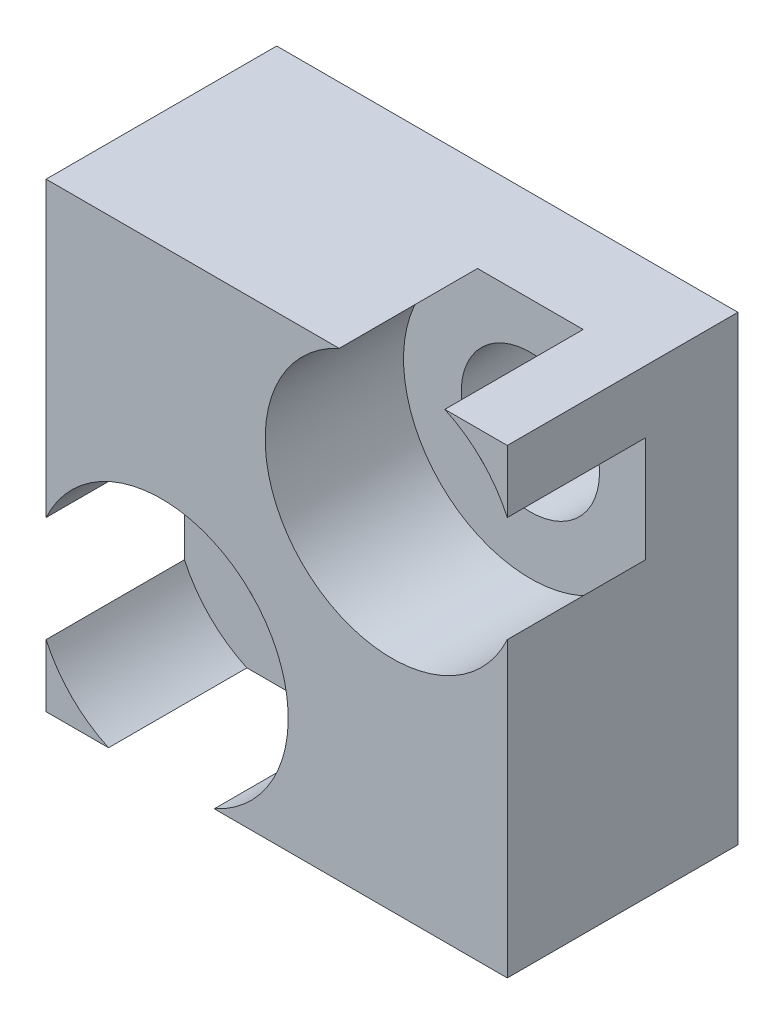
ISO-10303-21;
HEADER;
FILE_DESCRIPTION(('STEP AP214'),'2;1');
FILE_NAME('part.step','',(''),(''),'','','');
FILE_SCHEMA(('AUTOMOTIVE_DESIGN { 1 0 10303 214 1 1 1 1 }'));
ENDSEC;
DATA;
#1=APPLICATION_CONTEXT('core data for automotive mechanical design processes');
#2=APPLICATION_PROTOCOL_DEFINITION('international standard','automotive_design',2000,#1);
#3=PRODUCT_CONTEXT('',#1,'mechanical');
#4=PRODUCT('Part','Part','',(#3));
#5=PRODUCT_RELATED_PRODUCT_CATEGORY('part','',(#4));
#6=PRODUCT_DEFINITION_FORMATION('','',#4);
#7=PRODUCT_DEFINITION_CONTEXT('part definition',#1,'design');
#8=PRODUCT_DEFINITION('design','',#6,#7);
#9=PRODUCT_DEFINITION_SHAPE('','',#8);
#10=(LENGTH_UNIT() NAMED_UNIT(*) SI_UNIT(.MILLI.,.METRE.));
#11=(NAMED_UNIT(*) PLANE_ANGLE_UNIT() SI_UNIT($,.RADIAN.));
#12=(NAMED_UNIT(*) SI_UNIT($,.STERADIAN.) SOLID_ANGLE_UNIT());
#13=UNCERTAINTY_MEASURE_WITH_UNIT(LENGTH_MEASURE(1.E-05),#10,'distance_accuracy_value','');
#14=(GEOMETRIC_REPRESENTATION_CONTEXT(3) GLOBAL_UNCERTAINTY_ASSIGNED_CONTEXT((#13)) GLOBAL_UNIT_ASSIGNED_CONTEXT((#10,
#11,#12)) REPRESENTATION_CONTEXT('',''));
#15=CARTESIAN_POINT('',(0.,0.,0.));
#16=DIRECTION('',(0.,0.,1.));
#17=DIRECTION('',(1.,0.,0.));
#18=AXIS2_PLACEMENT_3D('',#15,#16,#17);
#19=CARTESIAN_POINT('',(0.,0.,10.));
#20=DIRECTION('',(0.,0.,-1.));
#21=DIRECTION('',(-1.,0.,0.));
#22=AXIS2_PLACEMENT_3D('',#19,#20,#21);
#23=PLANE('',#22);
#24=CARTESIAN_POINT('',(15.,15.,10.));
#25=DIRECTION('',(0.,0.,1.));
#26=DIRECTION('',(1.,0.,0.));
#27=AXIS2_PLACEMENT_3D('',#24,#25,#26);
#28=CIRCLE('',#27,5.49999999999999);
#29=CARTESIAN_POINT('',(20.,17.2912878474779,10.));
#30=VERTEX_POINT('',#29);
#31=CARTESIAN_POINT('',(17.2912878474779,20.,10.));
#32=VERTEX_POINT('',#31);
#33=EDGE_CURVE('E132',#30,#32,#28,.T.);
#34=ORIENTED_EDGE('',*,*,#33,.F.);
#35=DIRECTION('',(0.,1.,0.));
#36=VECTOR('',#35,1.);
#37=CARTESIAN_POINT('',(20.,0.,10.));
#38=LINE('',#37,#36);
#39=CARTESIAN_POINT('',(20.,20.,10.));
#40=VERTEX_POINT('',#39);
#41=EDGE_CURVE('E145',#30,#40,#38,.T.);
#42=ORIENTED_EDGE('',*,*,#41,.T.);
#43=DIRECTION('',(-1.,0.,0.));
#44=VECTOR('',#43,1.);
#45=CARTESIAN_POINT('',(0.,20.,10.));
#46=LINE('',#45,#44);
#47=EDGE_CURVE('E150',#40,#32,#46,.T.);
#48=ORIENTED_EDGE('',*,*,#47,.T.);
#49=EDGE_LOOP('',(#34,#42,#48));
#50=FACE_BOUND('',#49,.T.);
#51=ADVANCED_FACE('F39',(#50),#23,.F.);
#52=CARTESIAN_POINT('',(12.7087121525221,20.,10.));
#53=VERTEX_POINT('',#52);
#54=CARTESIAN_POINT('',(20.,12.7087121525221,10.));
#55=VERTEX_POINT('',#54);
#56=EDGE_CURVE('E147',#53,#55,#28,.T.);
#57=ORIENTED_EDGE('',*,*,#56,.F.);
#58=CARTESIAN_POINT('',(0.,20.,10.));
#59=VERTEX_POINT('',#58);
#60=EDGE_CURVE('E158',#53,#59,#46,.T.);
#61=ORIENTED_EDGE('',*,*,#60,.T.);
#62=DIRECTION('',(0.,-1.,0.));
#63=VECTOR('',#62,1.);
#64=CARTESIAN_POINT('',(0.,0.,10.));
#65=LINE('',#64,#63);
#66=CARTESIAN_POINT('',(0.,7.29128784747791,10.));
#67=VERTEX_POINT('',#66);
#68=EDGE_CURVE('E226',#59,#67,#65,.T.);
#69=ORIENTED_EDGE('',*,*,#68,.T.);
#70=CARTESIAN_POINT('',(5.,5.,10.));
#71=DIRECTION('',(0.,0.,-1.));
#72=DIRECTION('',(-1.,0.,0.));
#73=AXIS2_PLACEMENT_3D('',#70,#71,#72);
#74=CIRCLE('',#73,5.5);
#75=CARTESIAN_POINT('',(7.29128784747791,0.,10.));
#76=VERTEX_POINT('',#75);
#77=EDGE_CURVE('E187',#67,#76,#74,.T.);
#78=ORIENTED_EDGE('',*,*,#77,.T.);
#79=DIRECTION('',(1.,0.,0.));
#80=VECTOR('',#79,1.);
#81=CARTESIAN_POINT('',(0.,0.,10.));
#82=LINE('',#81,#80);
#83=CARTESIAN_POINT('',(20.,0.,10.));
#84=VERTEX_POINT('',#83);
#85=EDGE_CURVE('E159',#76,#84,#82,.T.);
#86=ORIENTED_EDGE('',*,*,#85,.T.);
#87=EDGE_CURVE('E152',#84,#55,#38,.T.);
#88=ORIENTED_EDGE('',*,*,#87,.T.);
#89=EDGE_LOOP('',(#57,#61,#69,#78,#86,#88));
#90=FACE_BOUND('',#89,.T.);
#91=ADVANCED_FACE('F251',(#90),#23,.F.);
#92=CARTESIAN_POINT('',(0.,0.,0.));
#93=DIRECTION('',(0.,0.,-1.));
#94=DIRECTION('',(-1.,0.,0.));
#95=AXIS2_PLACEMENT_3D('',#92,#93,#94);
#96=PLANE('',#95);
#97=CARTESIAN_POINT('',(15.,15.,0.));
#98=DIRECTION('',(0.,0.,1.));
#99=DIRECTION('',(1.,0.,0.));
#100=AXIS2_PLACEMENT_3D('',#97,#98,#99);
#101=CIRCLE('',#100,3.00000000000001);
#102=CARTESIAN_POINT('',(18.,15.,0.));
#103=VERTEX_POINT('',#102);
#104=EDGE_CURVE('E140',#103,#103,#101,.T.);
#105=ORIENTED_EDGE('',*,*,#104,.T.);
#106=EDGE_LOOP('',(#105));
#107=FACE_BOUND('',#106,.T.);
#108=DIRECTION('',(0.,-1.,0.));
#109=VECTOR('',#108,1.);
#110=CARTESIAN_POINT('',(0.,0.,0.));
#111=LINE('',#110,#109);
#112=CARTESIAN_POINT('',(0.,20.,0.));
#113=VERTEX_POINT('',#112);
#114=CARTESIAN_POINT('',(0.,0.,0.));
#115=VERTEX_POINT('',#114);
#116=EDGE_CURVE('E167',#113,#115,#111,.T.);
#117=ORIENTED_EDGE('',*,*,#116,.F.);
#118=DIRECTION('',(-1.,0.,0.));
#119=VECTOR('',#118,1.);
#120=CARTESIAN_POINT('',(0.,20.,0.));
#121=LINE('',#120,#119);
#122=CARTESIAN_POINT('',(20.,20.,0.));
#123=VERTEX_POINT('',#122);
#124=EDGE_CURVE('E175',#123,#113,#121,.T.);
#125=ORIENTED_EDGE('',*,*,#124,.F.);
#126=DIRECTION('',(0.,1.,0.));
#127=VECTOR('',#126,1.);
#128=CARTESIAN_POINT('',(20.,0.,0.));
#129=LINE('',#128,#127);
#130=CARTESIAN_POINT('',(20.,0.,0.));
#131=VERTEX_POINT('',#130);
#132=EDGE_CURVE('E174',#131,#123,#129,.T.);
#133=ORIENTED_EDGE('',*,*,#132,.F.);
#134=DIRECTION('',(1.,0.,0.));
#135=VECTOR('',#134,1.);
#136=CARTESIAN_POINT('',(0.,0.,0.));
#137=LINE('',#136,#135);
#138=EDGE_CURVE('E166',#115,#131,#137,.T.);
#139=ORIENTED_EDGE('',*,*,#138,.F.);
#140=EDGE_LOOP('',(#117,#125,#133,#139));
#141=FACE_BOUND('',#140,.T.);
#142=CARTESIAN_POINT('',(5.,5.,0.));
#143=DIRECTION('',(0.,0.,1.));
#144=DIRECTION('',(1.,0.,0.));
#145=AXIS2_PLACEMENT_3D('',#142,#143,#144);
#146=CIRCLE('',#145,3.00000000000001);
#147=CARTESIAN_POINT('',(8.00000000000001,5.,0.));
#148=VERTEX_POINT('',#147);
#149=EDGE_CURVE('E218',#148,#148,#146,.T.);
#150=ORIENTED_EDGE('',*,*,#149,.T.);
#151=EDGE_LOOP('',(#150));
#152=FACE_BOUND('',#151,.T.);
#153=ADVANCED_FACE('F247',(#107,#141,#152),#96,.T.);
#154=CARTESIAN_POINT('',(0.,0.,10.));
#155=DIRECTION('',(1.,0.,0.));
#156=DIRECTION('',(0.,0.,-1.));
#157=AXIS2_PLACEMENT_3D('',#154,#155,#156);
#158=PLANE('',#157);
#159=DIRECTION('',(0.,1.,0.));
#160=VECTOR('',#159,1.);
#161=CARTESIAN_POINT('',(0.,0.,4.));
#162=LINE('',#161,#160);
#163=CARTESIAN_POINT('',(0.,2.70871215252209,4.));
#164=VERTEX_POINT('',#163);
#165=CARTESIAN_POINT('',(0.,7.29128784747791,4.));
#166=VERTEX_POINT('',#165);
#167=EDGE_CURVE('E192',#164,#166,#162,.T.);
#168=ORIENTED_EDGE('',*,*,#167,.T.);
#169=DIRECTION('',(0.,0.,1.));
#170=VECTOR('',#169,1.);
#171=CARTESIAN_POINT('',(0.,7.29128784747791,10.));
#172=LINE('',#171,#170);
#173=EDGE_CURVE('E168',#166,#67,#172,.T.);
#174=ORIENTED_EDGE('',*,*,#173,.T.);
#175=ORIENTED_EDGE('',*,*,#68,.F.);
#176=DIRECTION('',(0.,0.,-1.));
#177=VECTOR('',#176,1.);
#178=CARTESIAN_POINT('',(0.,20.,10.));
#179=LINE('',#178,#177);
#180=EDGE_CURVE('E164',#59,#113,#179,.T.);
#181=ORIENTED_EDGE('',*,*,#180,.T.);
#182=ORIENTED_EDGE('',*,*,#116,.T.);
#183=DIRECTION('',(0.,0.,-1.));
#184=VECTOR('',#183,1.);
#185=CARTESIAN_POINT('',(0.,0.,10.));
#186=LINE('',#185,#184);
#187=CARTESIAN_POINT('',(0.,0.,10.));
#188=VERTEX_POINT('',#187);
#189=EDGE_CURVE('E181',#188,#115,#186,.T.);
#190=ORIENTED_EDGE('',*,*,#189,.F.);
#191=CARTESIAN_POINT('',(0.,2.70871215252209,10.));
#192=VERTEX_POINT('',#191);
#193=EDGE_CURVE('E176',#192,#188,#65,.T.);
#194=ORIENTED_EDGE('',*,*,#193,.F.);
#195=DIRECTION('',(0.,0.,1.));
#196=VECTOR('',#195,1.);
#197=CARTESIAN_POINT('',(0.,2.70871215252209,10.));
#198=LINE('',#197,#196);
#199=EDGE_CURVE('E64',#192,#164,#198,.F.);
#200=ORIENTED_EDGE('',*,*,#199,.T.);
#201=EDGE_LOOP('',(#168,#174,#175,#181,#182,#190,#194,#200));
#202=FACE_BOUND('',#201,.T.);
#203=ADVANCED_FACE('F41',(#202),#158,.F.);
#204=CARTESIAN_POINT('',(0.,0.,10.));
#205=DIRECTION('',(0.,1.,0.));
#206=DIRECTION('',(0.,0.,1.));
#207=AXIS2_PLACEMENT_3D('',#204,#205,#206);
#208=PLANE('',#207);
#209=DIRECTION('',(-1.,0.,0.));
#210=VECTOR('',#209,1.);
#211=CARTESIAN_POINT('',(0.,0.,4.));
#212=LINE('',#211,#210);
#213=CARTESIAN_POINT('',(7.29128784747791,0.,4.));
#214=VERTEX_POINT('',#213);
#215=CARTESIAN_POINT('',(2.70871215252209,0.,4.));
#216=VERTEX_POINT('',#215);
#217=EDGE_CURVE('E190',#214,#216,#212,.T.);
#218=ORIENTED_EDGE('',*,*,#217,.T.);
#219=DIRECTION('',(0.,0.,1.));
#220=VECTOR('',#219,1.);
#221=CARTESIAN_POINT('',(2.70871215252209,0.,10.));
#222=LINE('',#221,#220);
#223=CARTESIAN_POINT('',(2.70871215252209,0.,10.));
#224=VERTEX_POINT('',#223);
#225=EDGE_CURVE('E228',#216,#224,#222,.T.);
#226=ORIENTED_EDGE('',*,*,#225,.T.);
#227=EDGE_CURVE('E154',#188,#224,#82,.T.);
#228=ORIENTED_EDGE('',*,*,#227,.F.);
#229=ORIENTED_EDGE('',*,*,#189,.T.);
#230=ORIENTED_EDGE('',*,*,#138,.T.);
#231=DIRECTION('',(0.,0.,-1.));
#232=VECTOR('',#231,1.);
#233=CARTESIAN_POINT('',(20.,0.,10.));
#234=LINE('',#233,#232);
#235=EDGE_CURVE('E180',#84,#131,#234,.T.);
#236=ORIENTED_EDGE('',*,*,#235,.F.);
#237=ORIENTED_EDGE('',*,*,#85,.F.);
#238=DIRECTION('',(0.,0.,1.));
#239=VECTOR('',#238,1.);
#240=CARTESIAN_POINT('',(7.29128784747791,0.,10.));
#241=LINE('',#240,#239);
#242=EDGE_CURVE('E224',#76,#214,#241,.F.);
#243=ORIENTED_EDGE('',*,*,#242,.T.);
#244=EDGE_LOOP('',(#218,#226,#228,#229,#230,#236,#237,#243));
#245=FACE_BOUND('',#244,.T.);
#246=ADVANCED_FACE('F244',(#245),#208,.F.);
#247=CARTESIAN_POINT('',(20.,0.,10.));
#248=DIRECTION('',(-1.,0.,0.));
#249=DIRECTION('',(0.,0.,1.));
#250=AXIS2_PLACEMENT_3D('',#247,#248,#249);
#251=PLANE('',#250);
#252=DIRECTION('',(0.,-1.,0.));
#253=VECTOR('',#252,1.);
#254=CARTESIAN_POINT('',(20.,0.,4.));
#255=LINE('',#254,#253);
#256=CARTESIAN_POINT('',(20.,17.2912878474779,4.));
#257=VERTEX_POINT('',#256);
#258=CARTESIAN_POINT('',(20.,12.7087121525221,4.));
#259=VERTEX_POINT('',#258);
#260=EDGE_CURVE('E11',#257,#259,#255,.T.);
#261=ORIENTED_EDGE('',*,*,#260,.T.);
#262=DIRECTION('',(0.,0.,1.));
#263=VECTOR('',#262,1.);
#264=CARTESIAN_POINT('',(20.,12.7087121525221,10.));
#265=LINE('',#264,#263);
#266=EDGE_CURVE('E138',#259,#55,#265,.T.);
#267=ORIENTED_EDGE('',*,*,#266,.T.);
#268=ORIENTED_EDGE('',*,*,#87,.F.);
#269=ORIENTED_EDGE('',*,*,#235,.T.);
#270=ORIENTED_EDGE('',*,*,#132,.T.);
#271=DIRECTION('',(0.,0.,-1.));
#272=VECTOR('',#271,1.);
#273=CARTESIAN_POINT('',(20.,20.,10.));
#274=LINE('',#273,#272);
#275=EDGE_CURVE('E153',#40,#123,#274,.T.);
#276=ORIENTED_EDGE('',*,*,#275,.F.);
#277=ORIENTED_EDGE('',*,*,#41,.F.);
#278=DIRECTION('',(0.,0.,1.));
#279=VECTOR('',#278,1.);
#280=CARTESIAN_POINT('',(20.,17.2912878474779,10.));
#281=LINE('',#280,#279);
#282=EDGE_CURVE('E128',#30,#257,#281,.F.);
#283=ORIENTED_EDGE('',*,*,#282,.T.);
#284=EDGE_LOOP('',(#261,#267,#268,#269,#270,#276,#277,#283));
#285=FACE_BOUND('',#284,.T.);
#286=ADVANCED_FACE('F151',(#285),#251,.F.);
#287=CARTESIAN_POINT('',(0.,20.,10.));
#288=DIRECTION('',(0.,-1.,0.));
#289=DIRECTION('',(0.,0.,-1.));
#290=AXIS2_PLACEMENT_3D('',#287,#288,#289);
#291=PLANE('',#290);
#292=DIRECTION('',(1.,0.,0.));
#293=VECTOR('',#292,1.);
#294=CARTESIAN_POINT('',(0.,20.,4.));
#295=LINE('',#294,#293);
#296=CARTESIAN_POINT('',(12.7087121525221,20.,4.));
#297=VERTEX_POINT('',#296);
#298=CARTESIAN_POINT('',(17.2912878474779,20.,4.));
#299=VERTEX_POINT('',#298);
#300=EDGE_CURVE('E198',#297,#299,#295,.T.);
#301=ORIENTED_EDGE('',*,*,#300,.T.);
#302=DIRECTION('',(0.,0.,1.));
#303=VECTOR('',#302,1.);
#304=CARTESIAN_POINT('',(17.2912878474779,20.,10.));
#305=LINE('',#304,#303);
#306=EDGE_CURVE('E50',#299,#32,#305,.T.);
#307=ORIENTED_EDGE('',*,*,#306,.T.);
#308=ORIENTED_EDGE('',*,*,#47,.F.);
#309=ORIENTED_EDGE('',*,*,#275,.T.);
#310=ORIENTED_EDGE('',*,*,#124,.T.);
#311=ORIENTED_EDGE('',*,*,#180,.F.);
#312=ORIENTED_EDGE('',*,*,#60,.F.);
#313=DIRECTION('',(0.,0.,1.));
#314=VECTOR('',#313,1.);
#315=CARTESIAN_POINT('',(12.7087121525221,20.,10.));
#316=LINE('',#315,#314);
#317=EDGE_CURVE('E53',#53,#297,#316,.F.);
#318=ORIENTED_EDGE('',*,*,#317,.T.);
#319=EDGE_LOOP('',(#301,#307,#308,#309,#310,#311,#312,#318));
#320=FACE_BOUND('',#319,.T.);
#321=ADVANCED_FACE('F200',(#320),#291,.F.);
#322=ORIENTED_EDGE('',*,*,#227,.T.);
#323=EDGE_CURVE('E188',#224,#192,#74,.T.);
#324=ORIENTED_EDGE('',*,*,#323,.T.);
#325=ORIENTED_EDGE('',*,*,#193,.T.);
#326=EDGE_LOOP('',(#322,#324,#325));
#327=FACE_BOUND('',#326,.T.);
#328=ADVANCED_FACE('F236',(#327),#23,.F.);
#329=CARTESIAN_POINT('',(8.00000000000001,5.,4.));
#330=DIRECTION('',(0.,0.,-1.));
#331=DIRECTION('',(-1.,0.,0.));
#332=AXIS2_PLACEMENT_3D('',#329,#330,#331);
#333=PLANE('',#332);
#334=CARTESIAN_POINT('',(5.,5.,4.));
#335=DIRECTION('',(0.,0.,1.));
#336=DIRECTION('',(1.,0.,0.));
#337=AXIS2_PLACEMENT_3D('',#334,#335,#336);
#338=CIRCLE('',#337,3.00000000000001);
#339=CARTESIAN_POINT('',(8.00000000000001,5.,4.));
#340=VERTEX_POINT('',#339);
#341=EDGE_CURVE('E216',#340,#340,#338,.T.);
#342=ORIENTED_EDGE('',*,*,#341,.F.);
#343=EDGE_LOOP('',(#342));
#344=FACE_BOUND('',#343,.T.);
#345=CARTESIAN_POINT('',(5.,5.,4.));
#346=DIRECTION('',(0.,0.,1.));
#347=DIRECTION('',(1.,0.,0.));
#348=AXIS2_PLACEMENT_3D('',#345,#346,#347);
#349=CIRCLE('',#348,5.5);
#350=EDGE_CURVE('E215',#214,#166,#349,.T.);
#351=ORIENTED_EDGE('',*,*,#350,.T.);
#352=ORIENTED_EDGE('',*,*,#167,.F.);
#353=EDGE_CURVE('E214',#164,#216,#349,.T.);
#354=ORIENTED_EDGE('',*,*,#353,.T.);
#355=ORIENTED_EDGE('',*,*,#217,.F.);
#356=EDGE_LOOP('',(#351,#352,#354,#355));
#357=FACE_BOUND('',#356,.T.);
#358=ADVANCED_FACE('F259',(#344,#357),#333,.F.);
#359=CARTESIAN_POINT('',(5.,5.,10.));
#360=DIRECTION('',(0.,0.,1.));
#361=DIRECTION('',(1.,0.,0.));
#362=AXIS2_PLACEMENT_3D('',#359,#360,#361);
#363=CYLINDRICAL_SURFACE('',#362,5.5);
#364=ORIENTED_EDGE('',*,*,#350,.F.);
#365=ORIENTED_EDGE('',*,*,#242,.F.);
#366=ORIENTED_EDGE('',*,*,#77,.F.);
#367=ORIENTED_EDGE('',*,*,#173,.F.);
#368=EDGE_LOOP('',(#364,#365,#366,#367));
#369=FACE_BOUND('',#368,.T.);
#370=ADVANCED_FACE('F260',(#369),#363,.F.);
#371=ORIENTED_EDGE('',*,*,#353,.F.);
#372=ORIENTED_EDGE('',*,*,#199,.F.);
#373=ORIENTED_EDGE('',*,*,#323,.F.);
#374=ORIENTED_EDGE('',*,*,#225,.F.);
#375=EDGE_LOOP('',(#371,#372,#373,#374));
#376=FACE_BOUND('',#375,.T.);
#377=ADVANCED_FACE('F261',(#376),#363,.F.);
#378=CARTESIAN_POINT('',(5.,5.,10.));
#379=DIRECTION('',(0.,0.,1.));
#380=DIRECTION('',(1.,0.,0.));
#381=AXIS2_PLACEMENT_3D('',#378,#379,#380);
#382=CYLINDRICAL_SURFACE('',#381,3.00000000000001);
#383=ORIENTED_EDGE('',*,*,#149,.F.);
#384=EDGE_LOOP('',(#383));
#385=FACE_BOUND('',#384,.T.);
#386=ORIENTED_EDGE('',*,*,#341,.T.);
#387=EDGE_LOOP('',(#386));
#388=FACE_BOUND('',#387,.T.);
#389=ADVANCED_FACE('F263',(#385,#388),#382,.F.);
#390=CARTESIAN_POINT('',(18.,15.,4.));
#391=DIRECTION('',(0.,0.,-1.));
#392=DIRECTION('',(-1.,0.,0.));
#393=AXIS2_PLACEMENT_3D('',#390,#391,#392);
#394=PLANE('',#393);
#395=CARTESIAN_POINT('',(15.,15.,4.));
#396=DIRECTION('',(0.,0.,1.));
#397=DIRECTION('',(1.,0.,0.));
#398=AXIS2_PLACEMENT_3D('',#395,#396,#397);
#399=CIRCLE('',#398,3.00000000000001);
#400=CARTESIAN_POINT('',(18.,15.,4.));
#401=VERTEX_POINT('',#400);
#402=EDGE_CURVE('E201',#401,#401,#399,.T.);
#403=ORIENTED_EDGE('',*,*,#402,.F.);
#404=EDGE_LOOP('',(#403));
#405=FACE_BOUND('',#404,.T.);
#406=CARTESIAN_POINT('',(15.,15.,4.));
#407=DIRECTION('',(0.,0.,1.));
#408=DIRECTION('',(1.,0.,0.));
#409=AXIS2_PLACEMENT_3D('',#406,#407,#408);
#410=CIRCLE('',#409,5.49999999999999);
#411=EDGE_CURVE('E136',#257,#299,#410,.T.);
#412=ORIENTED_EDGE('',*,*,#411,.T.);
#413=ORIENTED_EDGE('',*,*,#300,.F.);
#414=EDGE_CURVE('E146',#297,#259,#410,.T.);
#415=ORIENTED_EDGE('',*,*,#414,.T.);
#416=ORIENTED_EDGE('',*,*,#260,.F.);
#417=EDGE_LOOP('',(#412,#413,#415,#416));
#418=FACE_BOUND('',#417,.T.);
#419=ADVANCED_FACE('F203',(#405,#418),#394,.F.);
#420=CARTESIAN_POINT('',(15.,15.,10.));
#421=DIRECTION('',(0.,0.,1.));
#422=DIRECTION('',(1.,0.,0.));
#423=AXIS2_PLACEMENT_3D('',#420,#421,#422);
#424=CYLINDRICAL_SURFACE('',#423,5.49999999999999);
#425=ORIENTED_EDGE('',*,*,#411,.F.);
#426=ORIENTED_EDGE('',*,*,#282,.F.);
#427=ORIENTED_EDGE('',*,*,#33,.T.);
#428=ORIENTED_EDGE('',*,*,#306,.F.);
#429=EDGE_LOOP('',(#425,#426,#427,#428));
#430=FACE_BOUND('',#429,.T.);
#431=ADVANCED_FACE('F134',(#430),#424,.F.);
#432=ORIENTED_EDGE('',*,*,#414,.F.);
#433=ORIENTED_EDGE('',*,*,#317,.F.);
#434=ORIENTED_EDGE('',*,*,#56,.T.);
#435=ORIENTED_EDGE('',*,*,#266,.F.);
#436=EDGE_LOOP('',(#432,#433,#434,#435));
#437=FACE_BOUND('',#436,.T.);
#438=ADVANCED_FACE('F305',(#437),#424,.F.);
#439=CARTESIAN_POINT('',(15.,15.,10.));
#440=DIRECTION('',(0.,0.,1.));
#441=DIRECTION('',(1.,0.,0.));
#442=AXIS2_PLACEMENT_3D('',#439,#440,#441);
#443=CYLINDRICAL_SURFACE('',#442,3.00000000000001);
#444=ORIENTED_EDGE('',*,*,#104,.F.);
#445=EDGE_LOOP('',(#444));
#446=FACE_BOUND('',#445,.T.);
#447=ORIENTED_EDGE('',*,*,#402,.T.);
#448=EDGE_LOOP('',(#447));
#449=FACE_BOUND('',#448,.T.);
#450=ADVANCED_FACE('F302',(#446,#449),#443,.F.);
#451=CLOSED_SHELL('',(#51,#91,#153,#203,#246,#286,#321,#328,#358,#370,#377,#389,#419,#431,#438,#450));
#452=MANIFOLD_SOLID_BREP('B2',#451);
#453=ADVANCED_BREP_SHAPE_REPRESENTATION('',(#18,#452),#14);
#454=SHAPE_DEFINITION_REPRESENTATION(#9,#453);
ENDSEC;
END-ISO-10303-21;
